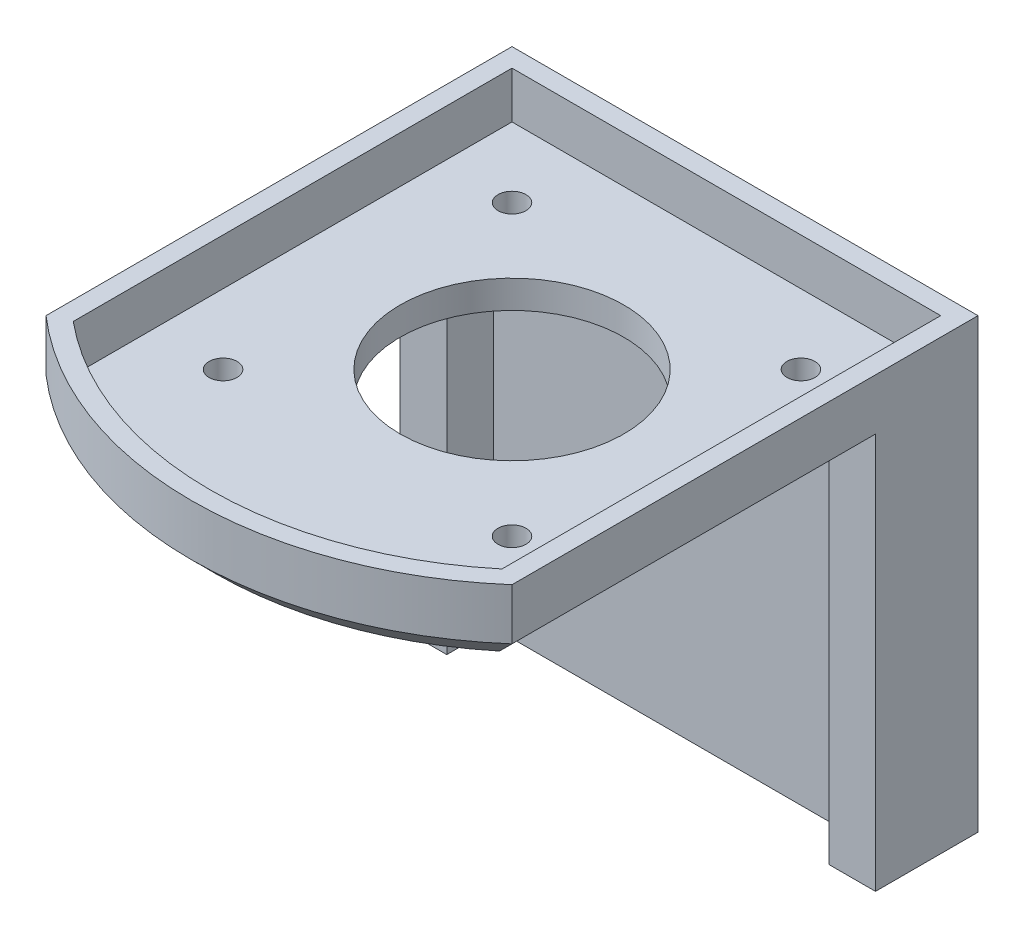
ISO-10303-21;
HEADER;
FILE_DESCRIPTION(('STEP AP214'),'2;1');
FILE_NAME('part.step','',(''),(''),'','','');
FILE_SCHEMA(('AUTOMOTIVE_DESIGN { 1 0 10303 214 1 1 1 1 }'));
ENDSEC;
DATA;
#1=APPLICATION_CONTEXT('core data for automotive mechanical design processes');
#2=APPLICATION_PROTOCOL_DEFINITION('international standard','automotive_design',2000,#1);
#3=PRODUCT_CONTEXT('',#1,'mechanical');
#4=PRODUCT('Part','Part','',(#3));
#5=PRODUCT_RELATED_PRODUCT_CATEGORY('part','',(#4));
#6=PRODUCT_DEFINITION_FORMATION('','',#4);
#7=PRODUCT_DEFINITION_CONTEXT('part definition',#1,'design');
#8=PRODUCT_DEFINITION('design','',#6,#7);
#9=PRODUCT_DEFINITION_SHAPE('','',#8);
#10=(LENGTH_UNIT() NAMED_UNIT(*) SI_UNIT(.MILLI.,.METRE.));
#11=(NAMED_UNIT(*) PLANE_ANGLE_UNIT() SI_UNIT($,.RADIAN.));
#12=(NAMED_UNIT(*) SI_UNIT($,.STERADIAN.) SOLID_ANGLE_UNIT());
#13=UNCERTAINTY_MEASURE_WITH_UNIT(LENGTH_MEASURE(1.E-05),#10,'distance_accuracy_value','');
#14=(GEOMETRIC_REPRESENTATION_CONTEXT(3) GLOBAL_UNCERTAINTY_ASSIGNED_CONTEXT((#13)) GLOBAL_UNIT_ASSIGNED_CONTEXT((#10,
#11,#12)) REPRESENTATION_CONTEXT('',''));
#15=CARTESIAN_POINT('',(0.,0.,0.));
#16=DIRECTION('',(0.,0.,1.));
#17=DIRECTION('',(1.,0.,0.));
#18=AXIS2_PLACEMENT_3D('',#15,#16,#17);
#19=CARTESIAN_POINT('',(0.,0.,0.));
#20=DIRECTION('',(0.,1.,0.));
#21=DIRECTION('',(0.,0.,1.));
#22=AXIS2_PLACEMENT_3D('',#19,#20,#21);
#23=PLANE('',#22);
#24=CARTESIAN_POINT('',(0.,0.,3.61817604250837));
#25=DIRECTION('',(0.,1.,0.));
#26=DIRECTION('',(0.,0.,1.));
#27=AXIS2_PLACEMENT_3D('',#24,#25,#26);
#28=CIRCLE('',#27,12.);
#29=CARTESIAN_POINT('',(0.,0.,15.6181760425084));
#30=VERTEX_POINT('',#29);
#31=EDGE_CURVE('E422',#30,#30,#28,.T.);
#32=ORIENTED_EDGE('',*,*,#31,.T.);
#33=EDGE_LOOP('',(#32));
#34=FACE_BOUND('',#33,.T.);
#35=CARTESIAN_POINT('',(15.5,0.,-11.8818239574916));
#36=DIRECTION('',(0.,1.,0.));
#37=DIRECTION('',(0.,0.,1.));
#38=AXIS2_PLACEMENT_3D('',#35,#36,#37);
#39=CIRCLE('',#38,1.5);
#40=CARTESIAN_POINT('',(15.5,0.,-10.3818239574916));
#41=VERTEX_POINT('',#40);
#42=EDGE_CURVE('E442',#41,#41,#39,.T.);
#43=ORIENTED_EDGE('',*,*,#42,.T.);
#44=EDGE_LOOP('',(#43));
#45=FACE_BOUND('',#44,.T.);
#46=CARTESIAN_POINT('',(-15.5,0.,-11.8818239574916));
#47=DIRECTION('',(0.,1.,0.));
#48=DIRECTION('',(0.,0.,1.));
#49=AXIS2_PLACEMENT_3D('',#46,#47,#48);
#50=CIRCLE('',#49,1.5);
#51=CARTESIAN_POINT('',(-15.5,0.,-10.3818239574916));
#52=VERTEX_POINT('',#51);
#53=EDGE_CURVE('E446',#52,#52,#50,.T.);
#54=ORIENTED_EDGE('',*,*,#53,.T.);
#55=EDGE_LOOP('',(#54));
#56=FACE_BOUND('',#55,.T.);
#57=CARTESIAN_POINT('',(-15.5,0.,19.1181760425084));
#58=DIRECTION('',(0.,1.,0.));
#59=DIRECTION('',(0.,0.,1.));
#60=AXIS2_PLACEMENT_3D('',#57,#58,#59);
#61=CIRCLE('',#60,1.5);
#62=CARTESIAN_POINT('',(-15.5,0.,20.6181760425084));
#63=VERTEX_POINT('',#62);
#64=EDGE_CURVE('E450',#63,#63,#61,.T.);
#65=ORIENTED_EDGE('',*,*,#64,.T.);
#66=EDGE_LOOP('',(#65));
#67=FACE_BOUND('',#66,.T.);
#68=CARTESIAN_POINT('',(15.5,0.,19.1181760425084));
#69=DIRECTION('',(0.,1.,0.));
#70=DIRECTION('',(0.,0.,1.));
#71=AXIS2_PLACEMENT_3D('',#68,#69,#70);
#72=CIRCLE('',#71,1.5);
#73=CARTESIAN_POINT('',(15.5,0.,20.6181760425084));
#74=VERTEX_POINT('',#73);
#75=EDGE_CURVE('E428',#74,#74,#72,.T.);
#76=ORIENTED_EDGE('',*,*,#75,.T.);
#77=EDGE_LOOP('',(#76));
#78=FACE_BOUND('',#77,.T.);
#79=DIRECTION('',(0.,0.,1.));
#80=VECTOR('',#79,1.);
#81=CARTESIAN_POINT('',(22.4999999999999,0.,0.));
#82=LINE('',#81,#80);
#83=CARTESIAN_POINT('',(22.4999999999998,0.,-10.3818239574916));
#84=VERTEX_POINT('',#83);
#85=CARTESIAN_POINT('',(22.5,0.,27.459060435492));
#86=VERTEX_POINT('',#85);
#87=EDGE_CURVE('E463',#84,#86,#82,.T.);
#88=ORIENTED_EDGE('',*,*,#87,.T.);
#89=CARTESIAN_POINT('',(0.,0.,0.));
#90=DIRECTION('',(0.,1.,0.));
#91=DIRECTION('',(0.,0.,1.));
#92=AXIS2_PLACEMENT_3D('',#89,#90,#91);
#93=CIRCLE('',#92,35.5);
#94=CARTESIAN_POINT('',(-22.5,0.,27.4590604354919));
#95=VERTEX_POINT('',#94);
#96=EDGE_CURVE('E59',#86,#95,#93,.F.);
#97=ORIENTED_EDGE('',*,*,#96,.T.);
#98=DIRECTION('',(0.,0.,-1.));
#99=VECTOR('',#98,1.);
#100=CARTESIAN_POINT('',(-22.5,0.,-9.38182395749164));
#101=LINE('',#100,#99);
#102=CARTESIAN_POINT('',(-22.5,0.,-9.38182395749164));
#103=VERTEX_POINT('',#102);
#104=EDGE_CURVE('E469',#95,#103,#101,.T.);
#105=ORIENTED_EDGE('',*,*,#104,.T.);
#106=DIRECTION('',(-1.,0.,0.));
#107=VECTOR('',#106,1.);
#108=CARTESIAN_POINT('',(-25.,0.,-9.38182395749164));
#109=LINE('',#108,#107);
#110=CARTESIAN_POINT('',(-20.,0.,-9.38182395749164));
#111=VERTEX_POINT('',#110);
#112=EDGE_CURVE('E284',#111,#103,#109,.T.);
#113=ORIENTED_EDGE('',*,*,#112,.F.);
#114=DIRECTION('',(0.,0.,1.));
#115=VECTOR('',#114,1.);
#116=CARTESIAN_POINT('',(-20.,0.,-9.38182395749164));
#117=LINE('',#116,#115);
#118=CARTESIAN_POINT('',(-20.,0.,-14.3818239574916));
#119=VERTEX_POINT('',#118);
#120=EDGE_CURVE('E317',#119,#111,#117,.T.);
#121=ORIENTED_EDGE('',*,*,#120,.F.);
#122=DIRECTION('',(-1.,0.,0.));
#123=VECTOR('',#122,1.);
#124=CARTESIAN_POINT('',(-20.,0.,-14.3818239574916));
#125=LINE('',#124,#123);
#126=CARTESIAN_POINT('',(20.,0.,-14.3818239574916));
#127=VERTEX_POINT('',#126);
#128=EDGE_CURVE('E313',#127,#119,#125,.T.);
#129=ORIENTED_EDGE('',*,*,#128,.F.);
#130=DIRECTION('',(0.,0.,-1.));
#131=VECTOR('',#130,1.);
#132=CARTESIAN_POINT('',(20.,0.,-14.3818239574916));
#133=LINE('',#132,#131);
#134=CARTESIAN_POINT('',(20.,0.,-10.3818239574916));
#135=VERTEX_POINT('',#134);
#136=EDGE_CURVE('E309',#135,#127,#133,.T.);
#137=ORIENTED_EDGE('',*,*,#136,.F.);
#138=DIRECTION('',(-1.,0.,0.));
#139=VECTOR('',#138,1.);
#140=CARTESIAN_POINT('',(20.,0.,-10.3818239574916));
#141=LINE('',#140,#139);
#142=EDGE_CURVE('E267',#84,#135,#141,.T.);
#143=ORIENTED_EDGE('',*,*,#142,.F.);
#144=EDGE_LOOP('',(#88,#97,#105,#113,#121,#129,#137,#143));
#145=FACE_BOUND('',#144,.T.);
#146=ADVANCED_FACE('F44',(#34,#45,#56,#67,#78,#145),#23,.F.);
#147=CARTESIAN_POINT('',(0.,3.,0.));
#148=DIRECTION('',(0.,-1.,0.));
#149=DIRECTION('',(0.,0.,-1.));
#150=AXIS2_PLACEMENT_3D('',#147,#148,#149);
#151=CYLINDRICAL_SURFACE('',#150,38.);
#152=DIRECTION('',(0.,-1.,0.));
#153=VECTOR('',#152,1.);
#154=CARTESIAN_POINT('',(-25.,3.,28.6181760425084));
#155=LINE('',#154,#153);
#156=CARTESIAN_POINT('',(-25.,8.,28.6181760425084));
#157=VERTEX_POINT('',#156);
#158=CARTESIAN_POINT('',(-25.,2.5,28.6181760425084));
#159=VERTEX_POINT('',#158);
#160=EDGE_CURVE('E423',#157,#159,#155,.T.);
#161=ORIENTED_EDGE('',*,*,#160,.T.);
#162=CARTESIAN_POINT('',(0.,2.50000000000002,0.));
#163=DIRECTION('',(0.,1.,0.));
#164=DIRECTION('',(0.,0.,1.));
#165=AXIS2_PLACEMENT_3D('',#162,#163,#164);
#166=CIRCLE('',#165,38.);
#167=CARTESIAN_POINT('',(25.,2.50000000000003,28.6181760425084));
#168=VERTEX_POINT('',#167);
#169=EDGE_CURVE('E480',#159,#168,#166,.T.);
#170=ORIENTED_EDGE('',*,*,#169,.T.);
#171=DIRECTION('',(0.,-1.,0.));
#172=VECTOR('',#171,1.);
#173=CARTESIAN_POINT('',(25.,3.,28.6181760425084));
#174=LINE('',#173,#172);
#175=CARTESIAN_POINT('',(25.,8.,28.6181760425084));
#176=VERTEX_POINT('',#175);
#177=EDGE_CURVE('E434',#176,#168,#174,.T.);
#178=ORIENTED_EDGE('',*,*,#177,.F.);
#179=CARTESIAN_POINT('',(0.,8.,0.));
#180=DIRECTION('',(0.,1.,0.));
#181=DIRECTION('',(0.,0.,1.));
#182=AXIS2_PLACEMENT_3D('',#179,#180,#181);
#183=CIRCLE('',#182,38.);
#184=EDGE_CURVE('E364',#157,#176,#183,.T.);
#185=ORIENTED_EDGE('',*,*,#184,.F.);
#186=EDGE_LOOP('',(#161,#170,#178,#185));
#187=FACE_BOUND('',#186,.T.);
#188=ADVANCED_FACE('F500',(#187),#151,.T.);
#189=CARTESIAN_POINT('',(24.9999999999999,3.,0.));
#190=DIRECTION('',(-1.,0.,0.));
#191=DIRECTION('',(0.,0.,1.));
#192=AXIS2_PLACEMENT_3D('',#189,#190,#191);
#193=PLANE('',#192);
#194=ORIENTED_EDGE('',*,*,#177,.T.);
#195=DIRECTION('',(0.,0.,-1.));
#196=VECTOR('',#195,1.);
#197=CARTESIAN_POINT('',(24.9999999999999,2.50000000000003,0.));
#198=LINE('',#197,#196);
#199=CARTESIAN_POINT('',(25.,2.50000000000003,-10.3818239574916));
#200=VERTEX_POINT('',#199);
#201=EDGE_CURVE('E438',#168,#200,#198,.T.);
#202=ORIENTED_EDGE('',*,*,#201,.T.);
#203=DIRECTION('',(0.,1.,0.));
#204=VECTOR('',#203,1.);
#205=CARTESIAN_POINT('',(25.,-40.,-10.3818239574916));
#206=LINE('',#205,#204);
#207=CARTESIAN_POINT('',(25.,-40.,-10.3818239574916));
#208=VERTEX_POINT('',#207);
#209=EDGE_CURVE('E342',#208,#200,#206,.T.);
#210=ORIENTED_EDGE('',*,*,#209,.F.);
#211=DIRECTION('',(0.,0.,1.));
#212=VECTOR('',#211,1.);
#213=CARTESIAN_POINT('',(25.,-40.,-10.3818239574916));
#214=LINE('',#213,#212);
#215=CARTESIAN_POINT('',(24.9999999999998,-40.,-21.3818239574916));
#216=VERTEX_POINT('',#215);
#217=EDGE_CURVE('E283',#216,#208,#214,.T.);
#218=ORIENTED_EDGE('',*,*,#217,.F.);
#219=DIRECTION('',(0.,-1.,0.));
#220=VECTOR('',#219,1.);
#221=CARTESIAN_POINT('',(24.9999999999998,3.,-21.3818239574916));
#222=LINE('',#221,#220);
#223=CARTESIAN_POINT('',(24.9999999999998,8.,-21.3818239574916));
#224=VERTEX_POINT('',#223);
#225=EDGE_CURVE('E431',#224,#216,#222,.T.);
#226=ORIENTED_EDGE('',*,*,#225,.F.);
#227=DIRECTION('',(0.,0.,-1.));
#228=VECTOR('',#227,1.);
#229=CARTESIAN_POINT('',(24.9999999999999,8.,0.));
#230=LINE('',#229,#228);
#231=EDGE_CURVE('E368',#176,#224,#230,.T.);
#232=ORIENTED_EDGE('',*,*,#231,.F.);
#233=EDGE_LOOP('',(#194,#202,#210,#218,#226,#232));
#234=FACE_BOUND('',#233,.T.);
#235=ADVANCED_FACE('F518',(#234),#193,.F.);
#236=CARTESIAN_POINT('',(0.,3.,-21.3818239574916));
#237=DIRECTION('',(0.,0.,-1.));
#238=DIRECTION('',(-1.,0.,0.));
#239=AXIS2_PLACEMENT_3D('',#236,#237,#238);
#240=PLANE('',#239);
#241=DIRECTION('',(-0.5,-0.866025403784439,0.));
#242=VECTOR('',#241,1.);
#243=CARTESIAN_POINT('',(10.6782032302754,-6.16506350946105,-21.3818239574916));
#244=LINE('',#243,#242);
#245=CARTESIAN_POINT('',(4.9999999999999,-16.,-21.3818239574916));
#246=VERTEX_POINT('',#245);
#247=CARTESIAN_POINT('',(2.4999999999999,-20.3301270189222,-21.3818239574916));
#248=VERTEX_POINT('',#247);
#249=EDGE_CURVE('E206',#246,#248,#244,.T.);
#250=ORIENTED_EDGE('',*,*,#249,.F.);
#251=DIRECTION('',(0.5,-0.866025403784439,0.));
#252=VECTOR('',#251,1.);
#253=CARTESIAN_POINT('',(-3.17820323027558,-1.83493649053895,-21.3818239574916));
#254=LINE('',#253,#252);
#255=CARTESIAN_POINT('',(2.4999999999999,-11.6698729810778,-21.3818239574916));
#256=VERTEX_POINT('',#255);
#257=EDGE_CURVE('E227',#256,#246,#254,.T.);
#258=ORIENTED_EDGE('',*,*,#257,.F.);
#259=DIRECTION('',(1.,0.,0.));
#260=VECTOR('',#259,1.);
#261=CARTESIAN_POINT('',(0.,-11.6698729810778,-21.3818239574916));
#262=LINE('',#261,#260);
#263=CARTESIAN_POINT('',(-2.50000000000009,-11.6698729810778,-21.3818239574916));
#264=VERTEX_POINT('',#263);
#265=EDGE_CURVE('E231',#264,#256,#262,.T.);
#266=ORIENTED_EDGE('',*,*,#265,.F.);
#267=DIRECTION('',(0.5,0.866025403784439,0.));
#268=VECTOR('',#267,1.);
#269=CARTESIAN_POINT('',(3.17820323027544,-1.83493649053886,-21.3818239574916));
#270=LINE('',#269,#268);
#271=CARTESIAN_POINT('',(-5.0000000000001,-16.,-21.3818239574916));
#272=VERTEX_POINT('',#271);
#273=EDGE_CURVE('E257',#272,#264,#270,.T.);
#274=ORIENTED_EDGE('',*,*,#273,.F.);
#275=DIRECTION('',(-0.5,0.866025403784439,0.));
#276=VECTOR('',#275,1.);
#277=CARTESIAN_POINT('',(-10.6782032302756,-6.16506350946114,-21.3818239574916));
#278=LINE('',#277,#276);
#279=CARTESIAN_POINT('',(-2.5000000000001,-20.3301270189222,-21.3818239574916));
#280=VERTEX_POINT('',#279);
#281=EDGE_CURVE('E253',#280,#272,#278,.T.);
#282=ORIENTED_EDGE('',*,*,#281,.F.);
#283=DIRECTION('',(-1.,0.,0.));
#284=VECTOR('',#283,1.);
#285=CARTESIAN_POINT('',(0.,-20.3301270189222,-21.3818239574916));
#286=LINE('',#285,#284);
#287=EDGE_CURVE('E249',#248,#280,#286,.T.);
#288=ORIENTED_EDGE('',*,*,#287,.F.);
#289=EDGE_LOOP('',(#250,#258,#266,#274,#282,#288));
#290=FACE_BOUND('',#289,.T.);
#291=ORIENTED_EDGE('',*,*,#225,.T.);
#292=DIRECTION('',(1.,0.,0.));
#293=VECTOR('',#292,1.);
#294=CARTESIAN_POINT('',(24.9999999999998,-40.,-21.3818239574916));
#295=LINE('',#294,#293);
#296=CARTESIAN_POINT('',(-25.,-40.,-21.3818239574916));
#297=VERTEX_POINT('',#296);
#298=EDGE_CURVE('E279',#297,#216,#295,.T.);
#299=ORIENTED_EDGE('',*,*,#298,.F.);
#300=DIRECTION('',(0.,-1.,0.));
#301=VECTOR('',#300,1.);
#302=CARTESIAN_POINT('',(-25.,3.,-21.3818239574916));
#303=LINE('',#302,#301);
#304=CARTESIAN_POINT('',(-25.,8.,-21.3818239574916));
#305=VERTEX_POINT('',#304);
#306=EDGE_CURVE('E427',#305,#297,#303,.T.);
#307=ORIENTED_EDGE('',*,*,#306,.F.);
#308=DIRECTION('',(-1.,0.,0.));
#309=VECTOR('',#308,1.);
#310=CARTESIAN_POINT('',(0.,8.,-21.3818239574916));
#311=LINE('',#310,#309);
#312=EDGE_CURVE('E372',#224,#305,#311,.T.);
#313=ORIENTED_EDGE('',*,*,#312,.F.);
#314=EDGE_LOOP('',(#291,#299,#307,#313));
#315=FACE_BOUND('',#314,.T.);
#316=ADVANCED_FACE('F528',(#290,#315),#240,.T.);
#317=CARTESIAN_POINT('',(-25.,3.,0.));
#318=DIRECTION('',(-1.,0.,0.));
#319=DIRECTION('',(0.,0.,1.));
#320=AXIS2_PLACEMENT_3D('',#317,#318,#319);
#321=PLANE('',#320);
#322=DIRECTION('',(0.,1.,0.));
#323=VECTOR('',#322,1.);
#324=CARTESIAN_POINT('',(-25.,-40.,-9.38182395749164));
#325=LINE('',#324,#323);
#326=CARTESIAN_POINT('',(-25.,-40.,-9.38182395749164));
#327=VERTEX_POINT('',#326);
#328=CARTESIAN_POINT('',(-25.,2.5,-9.38182395749164));
#329=VERTEX_POINT('',#328);
#330=EDGE_CURVE('E306',#327,#329,#325,.T.);
#331=ORIENTED_EDGE('',*,*,#330,.T.);
#332=DIRECTION('',(0.,0.,1.));
#333=VECTOR('',#332,1.);
#334=CARTESIAN_POINT('',(-25.,2.5,28.6181760425084));
#335=LINE('',#334,#333);
#336=EDGE_CURVE('E472',#329,#159,#335,.T.);
#337=ORIENTED_EDGE('',*,*,#336,.T.);
#338=ORIENTED_EDGE('',*,*,#160,.F.);
#339=DIRECTION('',(0.,0.,1.));
#340=VECTOR('',#339,1.);
#341=CARTESIAN_POINT('',(-25.,8.,0.));
#342=LINE('',#341,#340);
#343=EDGE_CURVE('E360',#305,#157,#342,.T.);
#344=ORIENTED_EDGE('',*,*,#343,.F.);
#345=ORIENTED_EDGE('',*,*,#306,.T.);
#346=DIRECTION('',(0.,0.,-1.));
#347=VECTOR('',#346,1.);
#348=CARTESIAN_POINT('',(-25.,-40.,-21.3818239574916));
#349=LINE('',#348,#347);
#350=EDGE_CURVE('E302',#327,#297,#349,.T.);
#351=ORIENTED_EDGE('',*,*,#350,.F.);
#352=EDGE_LOOP('',(#331,#337,#338,#344,#345,#351));
#353=FACE_BOUND('',#352,.T.);
#354=ADVANCED_FACE('F525',(#353),#321,.T.);
#355=CARTESIAN_POINT('',(0.,3.,0.));
#356=DIRECTION('',(0.,1.,0.));
#357=DIRECTION('',(0.,0.,1.));
#358=AXIS2_PLACEMENT_3D('',#355,#356,#357);
#359=PLANE('',#358);
#360=CARTESIAN_POINT('',(0.,3.,0.));
#361=DIRECTION('',(0.,1.,0.));
#362=DIRECTION('',(0.,0.,1.));
#363=AXIS2_PLACEMENT_3D('',#360,#361,#362);
#364=CIRCLE('',#363,36.);
#365=CARTESIAN_POINT('',(-23.,3.,27.6947648482525));
#366=VERTEX_POINT('',#365);
#367=CARTESIAN_POINT('',(23.,3.,27.6947648482525));
#368=VERTEX_POINT('',#367);
#369=EDGE_CURVE('E345',#366,#368,#364,.T.);
#370=ORIENTED_EDGE('',*,*,#369,.T.);
#371=DIRECTION('',(0.,0.,1.));
#372=VECTOR('',#371,1.);
#373=CARTESIAN_POINT('',(23.,3.,0.));
#374=LINE('',#373,#372);
#375=CARTESIAN_POINT('',(23.,3.,-19.3818239574916));
#376=VERTEX_POINT('',#375);
#377=EDGE_CURVE('E351',#376,#368,#374,.T.);
#378=ORIENTED_EDGE('',*,*,#377,.F.);
#379=DIRECTION('',(1.,0.,0.));
#380=VECTOR('',#379,1.);
#381=CARTESIAN_POINT('',(0.,3.,-19.3818239574916));
#382=LINE('',#381,#380);
#383=CARTESIAN_POINT('',(-23.,3.,-19.3818239574916));
#384=VERTEX_POINT('',#383);
#385=EDGE_CURVE('E383',#384,#376,#382,.T.);
#386=ORIENTED_EDGE('',*,*,#385,.F.);
#387=DIRECTION('',(0.,0.,-1.));
#388=VECTOR('',#387,1.);
#389=CARTESIAN_POINT('',(-23.,3.,0.));
#390=LINE('',#389,#388);
#391=EDGE_CURVE('E380',#366,#384,#390,.T.);
#392=ORIENTED_EDGE('',*,*,#391,.F.);
#393=EDGE_LOOP('',(#370,#378,#386,#392));
#394=FACE_BOUND('',#393,.T.);
#395=CARTESIAN_POINT('',(15.5,3.,19.1181760425084));
#396=DIRECTION('',(0.,1.,0.));
#397=DIRECTION('',(0.,0.,1.));
#398=AXIS2_PLACEMENT_3D('',#395,#396,#397);
#399=CIRCLE('',#398,1.5);
#400=CARTESIAN_POINT('',(15.5,3.,20.6181760425084));
#401=VERTEX_POINT('',#400);
#402=EDGE_CURVE('E402',#401,#401,#399,.T.);
#403=ORIENTED_EDGE('',*,*,#402,.F.);
#404=EDGE_LOOP('',(#403));
#405=FACE_BOUND('',#404,.T.);
#406=CARTESIAN_POINT('',(-15.5,3.,19.1181760425084));
#407=DIRECTION('',(0.,1.,0.));
#408=DIRECTION('',(0.,0.,1.));
#409=AXIS2_PLACEMENT_3D('',#406,#407,#408);
#410=CIRCLE('',#409,1.5);
#411=CARTESIAN_POINT('',(-15.5,3.,20.6181760425084));
#412=VERTEX_POINT('',#411);
#413=EDGE_CURVE('E412',#412,#412,#410,.T.);
#414=ORIENTED_EDGE('',*,*,#413,.F.);
#415=EDGE_LOOP('',(#414));
#416=FACE_BOUND('',#415,.T.);
#417=CARTESIAN_POINT('',(-15.5,3.,-11.8818239574916));
#418=DIRECTION('',(0.,1.,0.));
#419=DIRECTION('',(0.,0.,1.));
#420=AXIS2_PLACEMENT_3D('',#417,#418,#419);
#421=CIRCLE('',#420,1.5);
#422=CARTESIAN_POINT('',(-15.5,3.,-10.3818239574916));
#423=VERTEX_POINT('',#422);
#424=EDGE_CURVE('E408',#423,#423,#421,.T.);
#425=ORIENTED_EDGE('',*,*,#424,.F.);
#426=EDGE_LOOP('',(#425));
#427=FACE_BOUND('',#426,.T.);
#428=CARTESIAN_POINT('',(15.5,3.,-11.8818239574916));
#429=DIRECTION('',(0.,1.,0.));
#430=DIRECTION('',(0.,0.,1.));
#431=AXIS2_PLACEMENT_3D('',#428,#429,#430);
#432=CIRCLE('',#431,1.5);
#433=CARTESIAN_POINT('',(15.5,3.,-10.3818239574916));
#434=VERTEX_POINT('',#433);
#435=EDGE_CURVE('E403',#434,#434,#432,.T.);
#436=ORIENTED_EDGE('',*,*,#435,.F.);
#437=EDGE_LOOP('',(#436));
#438=FACE_BOUND('',#437,.T.);
#439=CARTESIAN_POINT('',(0.,3.,3.61817604250837));
#440=DIRECTION('',(0.,1.,0.));
#441=DIRECTION('',(0.,0.,1.));
#442=AXIS2_PLACEMENT_3D('',#439,#440,#441);
#443=CIRCLE('',#442,12.);
#444=CARTESIAN_POINT('',(0.,3.,15.6181760425084));
#445=VERTEX_POINT('',#444);
#446=EDGE_CURVE('E407',#445,#445,#443,.T.);
#447=ORIENTED_EDGE('',*,*,#446,.F.);
#448=EDGE_LOOP('',(#447));
#449=FACE_BOUND('',#448,.T.);
#450=ADVANCED_FACE('F523',(#394,#405,#416,#427,#438,#449),#359,.T.);
#451=CARTESIAN_POINT('',(0.,-1.,3.61817604250837));
#452=DIRECTION('',(0.,1.,0.));
#453=DIRECTION('',(0.,0.,1.));
#454=AXIS2_PLACEMENT_3D('',#451,#452,#453);
#455=CYLINDRICAL_SURFACE('',#454,12.);
#456=ORIENTED_EDGE('',*,*,#446,.T.);
#457=EDGE_LOOP('',(#456));
#458=FACE_BOUND('',#457,.T.);
#459=ORIENTED_EDGE('',*,*,#31,.F.);
#460=EDGE_LOOP('',(#459));
#461=FACE_BOUND('',#460,.T.);
#462=ADVANCED_FACE('F616',(#458,#461),#455,.F.);
#463=CARTESIAN_POINT('',(15.5,-1.,-11.8818239574916));
#464=DIRECTION('',(0.,1.,0.));
#465=DIRECTION('',(0.,0.,1.));
#466=AXIS2_PLACEMENT_3D('',#463,#464,#465);
#467=CYLINDRICAL_SURFACE('',#466,1.5);
#468=ORIENTED_EDGE('',*,*,#435,.T.);
#469=EDGE_LOOP('',(#468));
#470=FACE_BOUND('',#469,.T.);
#471=ORIENTED_EDGE('',*,*,#42,.F.);
#472=EDGE_LOOP('',(#471));
#473=FACE_BOUND('',#472,.T.);
#474=ADVANCED_FACE('F612',(#470,#473),#467,.F.);
#475=CARTESIAN_POINT('',(-15.5,-1.,-11.8818239574916));
#476=DIRECTION('',(0.,1.,0.));
#477=DIRECTION('',(0.,0.,1.));
#478=AXIS2_PLACEMENT_3D('',#475,#476,#477);
#479=CYLINDRICAL_SURFACE('',#478,1.5);
#480=ORIENTED_EDGE('',*,*,#424,.T.);
#481=EDGE_LOOP('',(#480));
#482=FACE_BOUND('',#481,.T.);
#483=ORIENTED_EDGE('',*,*,#53,.F.);
#484=EDGE_LOOP('',(#483));
#485=FACE_BOUND('',#484,.T.);
#486=ADVANCED_FACE('F615',(#482,#485),#479,.F.);
#487=CARTESIAN_POINT('',(-15.5,-1.,19.1181760425084));
#488=DIRECTION('',(0.,1.,0.));
#489=DIRECTION('',(0.,0.,1.));
#490=AXIS2_PLACEMENT_3D('',#487,#488,#489);
#491=CYLINDRICAL_SURFACE('',#490,1.5);
#492=ORIENTED_EDGE('',*,*,#413,.T.);
#493=EDGE_LOOP('',(#492));
#494=FACE_BOUND('',#493,.T.);
#495=ORIENTED_EDGE('',*,*,#64,.F.);
#496=EDGE_LOOP('',(#495));
#497=FACE_BOUND('',#496,.T.);
#498=ADVANCED_FACE('F620',(#494,#497),#491,.F.);
#499=CARTESIAN_POINT('',(15.5,-1.,19.1181760425084));
#500=DIRECTION('',(0.,1.,0.));
#501=DIRECTION('',(0.,0.,1.));
#502=AXIS2_PLACEMENT_3D('',#499,#500,#501);
#503=CYLINDRICAL_SURFACE('',#502,1.5);
#504=ORIENTED_EDGE('',*,*,#402,.T.);
#505=EDGE_LOOP('',(#504));
#506=FACE_BOUND('',#505,.T.);
#507=ORIENTED_EDGE('',*,*,#75,.F.);
#508=EDGE_LOOP('',(#507));
#509=FACE_BOUND('',#508,.T.);
#510=ADVANCED_FACE('F610',(#506,#509),#503,.F.);
#511=CARTESIAN_POINT('',(0.,8.,0.));
#512=DIRECTION('',(0.,-1.,0.));
#513=DIRECTION('',(0.,0.,-1.));
#514=AXIS2_PLACEMENT_3D('',#511,#512,#513);
#515=CYLINDRICAL_SURFACE('',#514,36.);
#516=ORIENTED_EDGE('',*,*,#369,.F.);
#517=DIRECTION('',(0.,-1.,0.));
#518=VECTOR('',#517,1.);
#519=CARTESIAN_POINT('',(-23.,8.,27.6947648482525));
#520=LINE('',#519,#518);
#521=CARTESIAN_POINT('',(-23.,8.,27.6947648482525));
#522=VERTEX_POINT('',#521);
#523=EDGE_CURVE('E399',#522,#366,#520,.T.);
#524=ORIENTED_EDGE('',*,*,#523,.F.);
#525=CARTESIAN_POINT('',(0.,8.,0.));
#526=DIRECTION('',(0.,1.,0.));
#527=DIRECTION('',(0.,0.,1.));
#528=AXIS2_PLACEMENT_3D('',#525,#526,#527);
#529=CIRCLE('',#528,36.);
#530=CARTESIAN_POINT('',(23.,8.,27.6947648482525));
#531=VERTEX_POINT('',#530);
#532=EDGE_CURVE('E346',#522,#531,#529,.T.);
#533=ORIENTED_EDGE('',*,*,#532,.T.);
#534=DIRECTION('',(0.,-1.,0.));
#535=VECTOR('',#534,1.);
#536=CARTESIAN_POINT('',(23.,8.,27.6947648482525));
#537=LINE('',#536,#535);
#538=EDGE_CURVE('E376',#531,#368,#537,.T.);
#539=ORIENTED_EDGE('',*,*,#538,.T.);
#540=EDGE_LOOP('',(#516,#524,#533,#539));
#541=FACE_BOUND('',#540,.T.);
#542=ADVANCED_FACE('F606',(#541),#515,.F.);
#543=CARTESIAN_POINT('',(-23.,8.,0.));
#544=DIRECTION('',(-1.,0.,0.));
#545=DIRECTION('',(0.,0.,1.));
#546=AXIS2_PLACEMENT_3D('',#543,#544,#545);
#547=PLANE('',#546);
#548=ORIENTED_EDGE('',*,*,#391,.T.);
#549=DIRECTION('',(0.,-1.,0.));
#550=VECTOR('',#549,1.);
#551=CARTESIAN_POINT('',(-23.,8.,-19.3818239574916));
#552=LINE('',#551,#550);
#553=CARTESIAN_POINT('',(-23.,8.,-19.3818239574916));
#554=VERTEX_POINT('',#553);
#555=EDGE_CURVE('E395',#554,#384,#552,.T.);
#556=ORIENTED_EDGE('',*,*,#555,.F.);
#557=DIRECTION('',(0.,0.,-1.));
#558=VECTOR('',#557,1.);
#559=CARTESIAN_POINT('',(-23.,8.,0.));
#560=LINE('',#559,#558);
#561=EDGE_CURVE('E350',#522,#554,#560,.T.);
#562=ORIENTED_EDGE('',*,*,#561,.F.);
#563=ORIENTED_EDGE('',*,*,#523,.T.);
#564=EDGE_LOOP('',(#548,#556,#562,#563));
#565=FACE_BOUND('',#564,.T.);
#566=ADVANCED_FACE('F602',(#565),#547,.F.);
#567=CARTESIAN_POINT('',(0.,8.,-19.3818239574916));
#568=DIRECTION('',(0.,0.,-1.));
#569=DIRECTION('',(-1.,0.,0.));
#570=AXIS2_PLACEMENT_3D('',#567,#568,#569);
#571=PLANE('',#570);
#572=ORIENTED_EDGE('',*,*,#385,.T.);
#573=DIRECTION('',(0.,-1.,0.));
#574=VECTOR('',#573,1.);
#575=CARTESIAN_POINT('',(23.,8.,-19.3818239574916));
#576=LINE('',#575,#574);
#577=CARTESIAN_POINT('',(23.,8.,-19.3818239574916));
#578=VERTEX_POINT('',#577);
#579=EDGE_CURVE('E392',#578,#376,#576,.T.);
#580=ORIENTED_EDGE('',*,*,#579,.F.);
#581=DIRECTION('',(1.,0.,0.));
#582=VECTOR('',#581,1.);
#583=CARTESIAN_POINT('',(0.,8.,-19.3818239574916));
#584=LINE('',#583,#582);
#585=EDGE_CURVE('E354',#554,#578,#584,.T.);
#586=ORIENTED_EDGE('',*,*,#585,.F.);
#587=ORIENTED_EDGE('',*,*,#555,.T.);
#588=EDGE_LOOP('',(#572,#580,#586,#587));
#589=FACE_BOUND('',#588,.T.);
#590=ADVANCED_FACE('F598',(#589),#571,.F.);
#591=CARTESIAN_POINT('',(23.,8.,0.));
#592=DIRECTION('',(1.,0.,0.));
#593=DIRECTION('',(0.,0.,-1.));
#594=AXIS2_PLACEMENT_3D('',#591,#592,#593);
#595=PLANE('',#594);
#596=ORIENTED_EDGE('',*,*,#377,.T.);
#597=ORIENTED_EDGE('',*,*,#538,.F.);
#598=DIRECTION('',(0.,0.,1.));
#599=VECTOR('',#598,1.);
#600=CARTESIAN_POINT('',(23.,8.,0.));
#601=LINE('',#600,#599);
#602=EDGE_CURVE('E357',#578,#531,#601,.T.);
#603=ORIENTED_EDGE('',*,*,#602,.F.);
#604=ORIENTED_EDGE('',*,*,#579,.T.);
#605=EDGE_LOOP('',(#596,#597,#603,#604));
#606=FACE_BOUND('',#605,.T.);
#607=ADVANCED_FACE('F594',(#606),#595,.F.);
#608=CARTESIAN_POINT('',(0.,8.,0.));
#609=DIRECTION('',(0.,1.,0.));
#610=DIRECTION('',(0.,0.,1.));
#611=AXIS2_PLACEMENT_3D('',#608,#609,#610);
#612=PLANE('',#611);
#613=ORIENTED_EDGE('',*,*,#532,.F.);
#614=ORIENTED_EDGE('',*,*,#561,.T.);
#615=ORIENTED_EDGE('',*,*,#585,.T.);
#616=ORIENTED_EDGE('',*,*,#602,.T.);
#617=EDGE_LOOP('',(#613,#614,#615,#616));
#618=FACE_BOUND('',#617,.T.);
#619=ORIENTED_EDGE('',*,*,#343,.T.);
#620=ORIENTED_EDGE('',*,*,#184,.T.);
#621=ORIENTED_EDGE('',*,*,#231,.T.);
#622=ORIENTED_EDGE('',*,*,#312,.T.);
#623=EDGE_LOOP('',(#619,#620,#621,#622));
#624=FACE_BOUND('',#623,.T.);
#625=ADVANCED_FACE('F557',(#618,#624),#612,.T.);
#626=CARTESIAN_POINT('',(20.,-40.,-10.3818239574916));
#627=DIRECTION('',(0.,0.,-1.));
#628=DIRECTION('',(-1.,0.,0.));
#629=AXIS2_PLACEMENT_3D('',#626,#627,#628);
#630=PLANE('',#629);
#631=ORIENTED_EDGE('',*,*,#209,.T.);
#632=DIRECTION('',(0.707106781186548,0.707106781186548,0.));
#633=VECTOR('',#632,1.);
#634=CARTESIAN_POINT('',(1.24999999999991,-21.2499999999999,-10.3818239574916));
#635=LINE('',#634,#633);
#636=EDGE_CURVE('E466',#200,#84,#635,.F.);
#637=ORIENTED_EDGE('',*,*,#636,.T.);
#638=ORIENTED_EDGE('',*,*,#142,.T.);
#639=DIRECTION('',(0.,1.,0.));
#640=VECTOR('',#639,1.);
#641=CARTESIAN_POINT('',(20.,-40.,-10.3818239574916));
#642=LINE('',#641,#640);
#643=CARTESIAN_POINT('',(20.,-40.,-10.3818239574916));
#644=VERTEX_POINT('',#643);
#645=EDGE_CURVE('E338',#644,#135,#642,.T.);
#646=ORIENTED_EDGE('',*,*,#645,.F.);
#647=DIRECTION('',(-1.,0.,0.));
#648=VECTOR('',#647,1.);
#649=CARTESIAN_POINT('',(20.,-40.,-10.3818239574916));
#650=LINE('',#649,#648);
#651=EDGE_CURVE('E287',#208,#644,#650,.T.);
#652=ORIENTED_EDGE('',*,*,#651,.F.);
#653=EDGE_LOOP('',(#631,#637,#638,#646,#652));
#654=FACE_BOUND('',#653,.T.);
#655=ADVANCED_FACE('F542',(#654),#630,.F.);
#656=CARTESIAN_POINT('',(20.,-40.,-14.3818239574916));
#657=DIRECTION('',(1.,0.,0.));
#658=DIRECTION('',(0.,0.,-1.));
#659=AXIS2_PLACEMENT_3D('',#656,#657,#658);
#660=PLANE('',#659);
#661=ORIENTED_EDGE('',*,*,#136,.T.);
#662=DIRECTION('',(0.,1.,0.));
#663=VECTOR('',#662,1.);
#664=CARTESIAN_POINT('',(20.,-40.,-14.3818239574916));
#665=LINE('',#664,#663);
#666=CARTESIAN_POINT('',(20.,-40.,-14.3818239574916));
#667=VERTEX_POINT('',#666);
#668=EDGE_CURVE('E334',#667,#127,#665,.T.);
#669=ORIENTED_EDGE('',*,*,#668,.F.);
#670=DIRECTION('',(0.,0.,-1.));
#671=VECTOR('',#670,1.);
#672=CARTESIAN_POINT('',(20.,-40.,-14.3818239574916));
#673=LINE('',#672,#671);
#674=EDGE_CURVE('E290',#644,#667,#673,.T.);
#675=ORIENTED_EDGE('',*,*,#674,.F.);
#676=ORIENTED_EDGE('',*,*,#645,.T.);
#677=EDGE_LOOP('',(#661,#669,#675,#676));
#678=FACE_BOUND('',#677,.T.);
#679=ADVANCED_FACE('F549',(#678),#660,.F.);
#680=CARTESIAN_POINT('',(-20.,-40.,-14.3818239574916));
#681=DIRECTION('',(0.,0.,-1.));
#682=DIRECTION('',(-1.,0.,0.));
#683=AXIS2_PLACEMENT_3D('',#680,#681,#682);
#684=PLANE('',#683);
#685=CARTESIAN_POINT('',(0.,-16.,-14.3818239574916));
#686=DIRECTION('',(0.,0.,-1.));
#687=DIRECTION('',(-1.,0.,0.));
#688=AXIS2_PLACEMENT_3D('',#685,#686,#687);
#689=CIRCLE('',#688,1.5);
#690=CARTESIAN_POINT('',(-1.50000000000009,-16.,-14.3818239574916));
#691=VERTEX_POINT('',#690);
#692=EDGE_CURVE('E250',#691,#691,#689,.T.);
#693=ORIENTED_EDGE('',*,*,#692,.T.);
#694=EDGE_LOOP('',(#693));
#695=FACE_BOUND('',#694,.T.);
#696=ORIENTED_EDGE('',*,*,#128,.T.);
#697=DIRECTION('',(0.,1.,0.));
#698=VECTOR('',#697,1.);
#699=CARTESIAN_POINT('',(-20.,-40.,-14.3818239574916));
#700=LINE('',#699,#698);
#701=CARTESIAN_POINT('',(-20.,-40.,-14.3818239574916));
#702=VERTEX_POINT('',#701);
#703=EDGE_CURVE('E330',#702,#119,#700,.T.);
#704=ORIENTED_EDGE('',*,*,#703,.F.);
#705=DIRECTION('',(-1.,0.,0.));
#706=VECTOR('',#705,1.);
#707=CARTESIAN_POINT('',(-20.,-40.,-14.3818239574916));
#708=LINE('',#707,#706);
#709=EDGE_CURVE('E293',#667,#702,#708,.T.);
#710=ORIENTED_EDGE('',*,*,#709,.F.);
#711=ORIENTED_EDGE('',*,*,#668,.T.);
#712=EDGE_LOOP('',(#696,#704,#710,#711));
#713=FACE_BOUND('',#712,.T.);
#714=ADVANCED_FACE('F576',(#695,#713),#684,.F.);
#715=CARTESIAN_POINT('',(-20.,-40.,-9.38182395749164));
#716=DIRECTION('',(-1.,0.,0.));
#717=DIRECTION('',(0.,0.,1.));
#718=AXIS2_PLACEMENT_3D('',#715,#716,#717);
#719=PLANE('',#718);
#720=ORIENTED_EDGE('',*,*,#120,.T.);
#721=DIRECTION('',(0.,1.,0.));
#722=VECTOR('',#721,1.);
#723=CARTESIAN_POINT('',(-20.,-40.,-9.38182395749164));
#724=LINE('',#723,#722);
#725=CARTESIAN_POINT('',(-20.,-40.,-9.38182395749164));
#726=VERTEX_POINT('',#725);
#727=EDGE_CURVE('E326',#726,#111,#724,.T.);
#728=ORIENTED_EDGE('',*,*,#727,.F.);
#729=DIRECTION('',(0.,0.,1.));
#730=VECTOR('',#729,1.);
#731=CARTESIAN_POINT('',(-20.,-40.,-9.38182395749164));
#732=LINE('',#731,#730);
#733=EDGE_CURVE('E296',#702,#726,#732,.T.);
#734=ORIENTED_EDGE('',*,*,#733,.F.);
#735=ORIENTED_EDGE('',*,*,#703,.T.);
#736=EDGE_LOOP('',(#720,#728,#734,#735));
#737=FACE_BOUND('',#736,.T.);
#738=ADVANCED_FACE('F572',(#737),#719,.F.);
#739=CARTESIAN_POINT('',(-25.,-40.,-9.38182395749164));
#740=DIRECTION('',(0.,0.,-1.));
#741=DIRECTION('',(-1.,0.,0.));
#742=AXIS2_PLACEMENT_3D('',#739,#740,#741);
#743=PLANE('',#742);
#744=ORIENTED_EDGE('',*,*,#112,.T.);
#745=DIRECTION('',(-0.707106781186546,0.707106781186549,0.));
#746=VECTOR('',#745,1.);
#747=CARTESIAN_POINT('',(-3.75,-18.7500000000001,-9.38182395749164));
#748=LINE('',#747,#746);
#749=EDGE_CURVE('E476',#103,#329,#748,.T.);
#750=ORIENTED_EDGE('',*,*,#749,.T.);
#751=ORIENTED_EDGE('',*,*,#330,.F.);
#752=DIRECTION('',(-1.,0.,0.));
#753=VECTOR('',#752,1.);
#754=CARTESIAN_POINT('',(-25.,-40.,-9.38182395749164));
#755=LINE('',#754,#753);
#756=EDGE_CURVE('E299',#726,#327,#755,.T.);
#757=ORIENTED_EDGE('',*,*,#756,.F.);
#758=ORIENTED_EDGE('',*,*,#727,.T.);
#759=EDGE_LOOP('',(#744,#750,#751,#757,#758));
#760=FACE_BOUND('',#759,.T.);
#761=ADVANCED_FACE('F565',(#760),#743,.F.);
#762=CARTESIAN_POINT('',(0.,-40.,0.));
#763=DIRECTION('',(0.,1.,0.));
#764=DIRECTION('',(0.,0.,1.));
#765=AXIS2_PLACEMENT_3D('',#762,#763,#764);
#766=PLANE('',#765);
#767=ORIENTED_EDGE('',*,*,#298,.T.);
#768=ORIENTED_EDGE('',*,*,#217,.T.);
#769=ORIENTED_EDGE('',*,*,#651,.T.);
#770=ORIENTED_EDGE('',*,*,#674,.T.);
#771=ORIENTED_EDGE('',*,*,#709,.T.);
#772=ORIENTED_EDGE('',*,*,#733,.T.);
#773=ORIENTED_EDGE('',*,*,#756,.T.);
#774=ORIENTED_EDGE('',*,*,#350,.T.);
#775=EDGE_LOOP('',(#767,#768,#769,#770,#771,#772,#773,#774));
#776=FACE_BOUND('',#775,.T.);
#777=ADVANCED_FACE('F551',(#776),#766,.F.);
#778=CARTESIAN_POINT('',(10.6782032302754,-6.16506350946105,-17.3818239574916));
#779=DIRECTION('',(0.866025403784439,-0.5,0.));
#780=DIRECTION('',(0.5,0.866025403784439,0.));
#781=AXIS2_PLACEMENT_3D('',#778,#779,#780);
#782=PLANE('',#781);
#783=ORIENTED_EDGE('',*,*,#249,.T.);
#784=DIRECTION('',(0.,0.,-1.));
#785=VECTOR('',#784,1.);
#786=CARTESIAN_POINT('',(2.4999999999999,-20.3301270189222,-17.3818239574916));
#787=LINE('',#786,#785);
#788=CARTESIAN_POINT('',(2.4999999999999,-20.3301270189222,-17.3818239574916));
#789=VERTEX_POINT('',#788);
#790=EDGE_CURVE('E199',#789,#248,#787,.T.);
#791=ORIENTED_EDGE('',*,*,#790,.F.);
#792=DIRECTION('',(-0.5,-0.866025403784439,0.));
#793=VECTOR('',#792,1.);
#794=CARTESIAN_POINT('',(10.6782032302754,-6.16506350946105,-17.3818239574916));
#795=LINE('',#794,#793);
#796=CARTESIAN_POINT('',(4.9999999999999,-16.,-17.3818239574916));
#797=VERTEX_POINT('',#796);
#798=EDGE_CURVE('E203',#797,#789,#795,.T.);
#799=ORIENTED_EDGE('',*,*,#798,.F.);
#800=DIRECTION('',(0.,0.,-1.));
#801=VECTOR('',#800,1.);
#802=CARTESIAN_POINT('',(4.9999999999999,-16.,-17.3818239574916));
#803=LINE('',#802,#801);
#804=EDGE_CURVE('E264',#797,#246,#803,.T.);
#805=ORIENTED_EDGE('',*,*,#804,.T.);
#806=EDGE_LOOP('',(#783,#791,#799,#805));
#807=FACE_BOUND('',#806,.T.);
#808=ADVANCED_FACE('F201',(#807),#782,.F.);
#809=CARTESIAN_POINT('',(-3.17820323027558,-1.83493649053895,-17.3818239574916));
#810=DIRECTION('',(0.866025403784439,0.5,0.));
#811=DIRECTION('',(-0.5,0.866025403784439,0.));
#812=AXIS2_PLACEMENT_3D('',#809,#810,#811);
#813=PLANE('',#812);
#814=ORIENTED_EDGE('',*,*,#257,.T.);
#815=ORIENTED_EDGE('',*,*,#804,.F.);
#816=DIRECTION('',(0.5,-0.866025403784439,0.));
#817=VECTOR('',#816,1.);
#818=CARTESIAN_POINT('',(-3.17820323027558,-1.83493649053895,-17.3818239574916));
#819=LINE('',#818,#817);
#820=CARTESIAN_POINT('',(2.4999999999999,-11.6698729810778,-17.3818239574916));
#821=VERTEX_POINT('',#820);
#822=EDGE_CURVE('E212',#821,#797,#819,.T.);
#823=ORIENTED_EDGE('',*,*,#822,.F.);
#824=DIRECTION('',(0.,0.,-1.));
#825=VECTOR('',#824,1.);
#826=CARTESIAN_POINT('',(2.4999999999999,-11.6698729810778,-17.3818239574916));
#827=LINE('',#826,#825);
#828=EDGE_CURVE('E268',#821,#256,#827,.T.);
#829=ORIENTED_EDGE('',*,*,#828,.T.);
#830=EDGE_LOOP('',(#814,#815,#823,#829));
#831=FACE_BOUND('',#830,.T.);
#832=ADVANCED_FACE('F753',(#831),#813,.F.);
#833=CARTESIAN_POINT('',(0.,-11.6698729810778,-17.3818239574916));
#834=DIRECTION('',(0.,1.,0.));
#835=DIRECTION('',(-1.,0.,0.));
#836=AXIS2_PLACEMENT_3D('',#833,#834,#835);
#837=PLANE('',#836);
#838=ORIENTED_EDGE('',*,*,#265,.T.);
#839=ORIENTED_EDGE('',*,*,#828,.F.);
#840=DIRECTION('',(1.,0.,0.));
#841=VECTOR('',#840,1.);
#842=CARTESIAN_POINT('',(0.,-11.6698729810778,-17.3818239574916));
#843=LINE('',#842,#841);
#844=CARTESIAN_POINT('',(-2.50000000000009,-11.6698729810778,-17.3818239574916));
#845=VERTEX_POINT('',#844);
#846=EDGE_CURVE('E242',#845,#821,#843,.T.);
#847=ORIENTED_EDGE('',*,*,#846,.F.);
#848=DIRECTION('',(0.,0.,-1.));
#849=VECTOR('',#848,1.);
#850=CARTESIAN_POINT('',(-2.50000000000009,-11.6698729810778,-17.3818239574916));
#851=LINE('',#850,#849);
#852=EDGE_CURVE('E271',#845,#264,#851,.T.);
#853=ORIENTED_EDGE('',*,*,#852,.T.);
#854=EDGE_LOOP('',(#838,#839,#847,#853));
#855=FACE_BOUND('',#854,.T.);
#856=ADVANCED_FACE('F759',(#855),#837,.F.);
#857=CARTESIAN_POINT('',(3.17820323027544,-1.83493649053886,-17.3818239574916));
#858=DIRECTION('',(-0.866025403784439,0.5,0.));
#859=DIRECTION('',(-0.5,-0.866025403784439,0.));
#860=AXIS2_PLACEMENT_3D('',#857,#858,#859);
#861=PLANE('',#860);
#862=ORIENTED_EDGE('',*,*,#273,.T.);
#863=ORIENTED_EDGE('',*,*,#852,.F.);
#864=DIRECTION('',(0.5,0.866025403784439,0.));
#865=VECTOR('',#864,1.);
#866=CARTESIAN_POINT('',(3.17820323027544,-1.83493649053886,-17.3818239574916));
#867=LINE('',#866,#865);
#868=CARTESIAN_POINT('',(-5.0000000000001,-16.,-17.3818239574916));
#869=VERTEX_POINT('',#868);
#870=EDGE_CURVE('E238',#869,#845,#867,.T.);
#871=ORIENTED_EDGE('',*,*,#870,.F.);
#872=DIRECTION('',(0.,0.,-1.));
#873=VECTOR('',#872,1.);
#874=CARTESIAN_POINT('',(-5.0000000000001,-16.,-17.3818239574916));
#875=LINE('',#874,#873);
#876=EDGE_CURVE('E274',#869,#272,#875,.T.);
#877=ORIENTED_EDGE('',*,*,#876,.T.);
#878=EDGE_LOOP('',(#862,#863,#871,#877));
#879=FACE_BOUND('',#878,.T.);
#880=ADVANCED_FACE('F767',(#879),#861,.F.);
#881=CARTESIAN_POINT('',(-10.6782032302756,-6.16506350946114,-17.3818239574916));
#882=DIRECTION('',(-0.866025403784439,-0.5,0.));
#883=DIRECTION('',(0.5,-0.866025403784439,0.));
#884=AXIS2_PLACEMENT_3D('',#881,#882,#883);
#885=PLANE('',#884);
#886=ORIENTED_EDGE('',*,*,#281,.T.);
#887=ORIENTED_EDGE('',*,*,#876,.F.);
#888=DIRECTION('',(-0.5,0.866025403784439,0.));
#889=VECTOR('',#888,1.);
#890=CARTESIAN_POINT('',(-10.6782032302756,-6.16506350946114,-17.3818239574916));
#891=LINE('',#890,#889);
#892=CARTESIAN_POINT('',(-2.5000000000001,-20.3301270189222,-17.3818239574916));
#893=VERTEX_POINT('',#892);
#894=EDGE_CURVE('E221',#893,#869,#891,.T.);
#895=ORIENTED_EDGE('',*,*,#894,.F.);
#896=DIRECTION('',(0.,0.,-1.));
#897=VECTOR('',#896,1.);
#898=CARTESIAN_POINT('',(-2.5000000000001,-20.3301270189222,-17.3818239574916));
#899=LINE('',#898,#897);
#900=EDGE_CURVE('E211',#893,#280,#899,.T.);
#901=ORIENTED_EDGE('',*,*,#900,.T.);
#902=EDGE_LOOP('',(#886,#887,#895,#901));
#903=FACE_BOUND('',#902,.T.);
#904=ADVANCED_FACE('F775',(#903),#885,.F.);
#905=CARTESIAN_POINT('',(0.,-20.3301270189222,-17.3818239574916));
#906=DIRECTION('',(0.,-1.,0.));
#907=DIRECTION('',(0.,0.,-1.));
#908=AXIS2_PLACEMENT_3D('',#905,#906,#907);
#909=PLANE('',#908);
#910=ORIENTED_EDGE('',*,*,#287,.T.);
#911=ORIENTED_EDGE('',*,*,#900,.F.);
#912=DIRECTION('',(-1.,0.,0.));
#913=VECTOR('',#912,1.);
#914=CARTESIAN_POINT('',(0.,-20.3301270189222,-17.3818239574916));
#915=LINE('',#914,#913);
#916=EDGE_CURVE('E215',#789,#893,#915,.T.);
#917=ORIENTED_EDGE('',*,*,#916,.F.);
#918=ORIENTED_EDGE('',*,*,#790,.T.);
#919=EDGE_LOOP('',(#910,#911,#917,#918));
#920=FACE_BOUND('',#919,.T.);
#921=ADVANCED_FACE('F216',(#920),#909,.F.);
#922=CARTESIAN_POINT('',(0.,0.,-17.3818239574916));
#923=DIRECTION('',(0.,0.,-1.));
#924=DIRECTION('',(-1.,0.,0.));
#925=AXIS2_PLACEMENT_3D('',#922,#923,#924);
#926=PLANE('',#925);
#927=CARTESIAN_POINT('',(0.,-16.,-17.3818239574916));
#928=DIRECTION('',(0.,0.,-1.));
#929=DIRECTION('',(-1.,0.,0.));
#930=AXIS2_PLACEMENT_3D('',#927,#928,#929);
#931=CIRCLE('',#930,1.5);
#932=CARTESIAN_POINT('',(-1.50000000000009,-16.,-17.3818239574916));
#933=VERTEX_POINT('',#932);
#934=EDGE_CURVE('E234',#933,#933,#931,.T.);
#935=ORIENTED_EDGE('',*,*,#934,.F.);
#936=EDGE_LOOP('',(#935));
#937=FACE_BOUND('',#936,.T.);
#938=ORIENTED_EDGE('',*,*,#798,.T.);
#939=ORIENTED_EDGE('',*,*,#916,.T.);
#940=ORIENTED_EDGE('',*,*,#894,.T.);
#941=ORIENTED_EDGE('',*,*,#870,.T.);
#942=ORIENTED_EDGE('',*,*,#846,.T.);
#943=ORIENTED_EDGE('',*,*,#822,.T.);
#944=EDGE_LOOP('',(#938,#939,#940,#941,#942,#943));
#945=FACE_BOUND('',#944,.T.);
#946=ADVANCED_FACE('F223',(#937,#945),#926,.T.);
#947=CARTESIAN_POINT('',(0.,-16.,-13.3818239574916));
#948=DIRECTION('',(0.,0.,-1.));
#949=DIRECTION('',(-1.,0.,0.));
#950=AXIS2_PLACEMENT_3D('',#947,#948,#949);
#951=CYLINDRICAL_SURFACE('',#950,1.5);
#952=ORIENTED_EDGE('',*,*,#934,.T.);
#953=EDGE_LOOP('',(#952));
#954=FACE_BOUND('',#953,.T.);
#955=ORIENTED_EDGE('',*,*,#692,.F.);
#956=EDGE_LOOP('',(#955));
#957=FACE_BOUND('',#956,.T.);
#958=ADVANCED_FACE('F499',(#954,#957),#951,.F.);
#959=CARTESIAN_POINT('',(24.9999999999999,2.50000000000003,0.));
#960=DIRECTION('',(-0.707106781186547,0.707106781186547,0.));
#961=DIRECTION('',(0.,0.,-1.));
#962=AXIS2_PLACEMENT_3D('',#959,#960,#961);
#963=PLANE('',#962);
#964=ORIENTED_EDGE('',*,*,#201,.F.);
#965=CARTESIAN_POINT('',(25.,2.50000000000002,28.6181760425084));
#966=CARTESIAN_POINT('',(24.7912580329798,2.29125803297985,28.523353397267));
#967=CARTESIAN_POINT('',(24.5826129619611,2.08261296196111,28.4281038844979));
#968=CARTESIAN_POINT('',(24.1655260421233,1.66552604212337,28.2367284916432));
#969=CARTESIAN_POINT('',(23.9570841914205,1.45708419142056,28.1406026197685));
#970=CARTESIAN_POINT('',(23.5404090746966,1.0404090746966,27.9474500281715));
#971=CARTESIAN_POINT('',(23.3321758088357,0.832175808835705,27.8504233077577));
#972=CARTESIAN_POINT('',(22.9159241953255,0.415924195325527,27.6554430508558));
#973=CARTESIAN_POINT('',(22.7079058497061,0.207905849706103,27.5574895057012));
#974=CARTESIAN_POINT('',(22.5,0.,27.459060435492));
#975=B_SPLINE_CURVE_WITH_KNOTS('',3,(#965,#966,#967,#968,#969,#970,#971,#972,#973,#974),
.UNSPECIFIED.,.F.,.F.,(4,2,2,2,4),(0.,0.930182439304123,1.86035617245139,2.79053061970261,
3.7207137733057),.UNSPECIFIED.);
#976=EDGE_CURVE('E73',#168,#86,#975,.T.);
#977=ORIENTED_EDGE('',*,*,#976,.T.);
#978=ORIENTED_EDGE('',*,*,#87,.F.);
#979=ORIENTED_EDGE('',*,*,#636,.F.);
#980=EDGE_LOOP('',(#964,#977,#978,#979));
#981=FACE_BOUND('',#980,.T.);
#982=ADVANCED_FACE('F491',(#981),#963,.F.);
#983=CARTESIAN_POINT('',(-22.5,0.,0.));
#984=DIRECTION('',(-0.707106781186549,-0.707106781186546,0.));
#985=DIRECTION('',(0.,0.,1.));
#986=AXIS2_PLACEMENT_3D('',#983,#984,#985);
#987=PLANE('',#986);
#988=ORIENTED_EDGE('',*,*,#104,.F.);
#989=CARTESIAN_POINT('',(-22.5,0.,27.4590604354919));
#990=CARTESIAN_POINT('',(-22.7079058497061,0.207905849706103,27.5574895057012));
#991=CARTESIAN_POINT('',(-22.9159241953255,0.415924195325528,27.6554430508557));
#992=CARTESIAN_POINT('',(-23.3321758088357,0.832175808835707,27.8504233077577));
#993=CARTESIAN_POINT('',(-23.5404090746966,1.0404090746966,27.9474500281715));
#994=CARTESIAN_POINT('',(-23.9570841914206,1.45708419142057,28.1406026197685));
#995=CARTESIAN_POINT('',(-24.1655260421234,1.66552604212337,28.2367284916432));
#996=CARTESIAN_POINT('',(-24.5826129619611,2.08261296196112,28.4281038844979));
#997=CARTESIAN_POINT('',(-24.7912580329799,2.29125803297986,28.523353397267));
#998=CARTESIAN_POINT('',(-25.,2.50000000000002,28.6181760425084));
#999=B_SPLINE_CURVE_WITH_KNOTS('',3,(#989,#990,#991,#992,#993,#994,#995,#996,#997,#998),
.UNSPECIFIED.,.F.,.F.,(4,2,2,2,4),(0.,0.930183153603091,1.8603576008543,2.79053133400157,
3.72071377330569),.UNSPECIFIED.);
#1000=EDGE_CURVE('E11',#95,#159,#999,.T.);
#1001=ORIENTED_EDGE('',*,*,#1000,.T.);
#1002=ORIENTED_EDGE('',*,*,#336,.F.);
#1003=ORIENTED_EDGE('',*,*,#749,.F.);
#1004=EDGE_LOOP('',(#988,#1001,#1002,#1003));
#1005=FACE_BOUND('',#1004,.T.);
#1006=ADVANCED_FACE('F498',(#1005),#987,.T.);
#1007=CARTESIAN_POINT('',(0.,2.50000000000002,0.));
#1008=DIRECTION('',(0.,1.,0.));
#1009=DIRECTION('',(0.,0.,1.));
#1010=AXIS2_PLACEMENT_3D('',#1007,#1008,#1009);
#1011=CONICAL_SURFACE('',#1010,38.,0.78539816339745);
#1012=ORIENTED_EDGE('',*,*,#1000,.F.);
#1013=ORIENTED_EDGE('',*,*,#96,.F.);
#1014=ORIENTED_EDGE('',*,*,#976,.F.);
#1015=ORIENTED_EDGE('',*,*,#169,.F.);
#1016=EDGE_LOOP('',(#1012,#1013,#1014,#1015));
#1017=FACE_BOUND('',#1016,.T.);
#1018=ADVANCED_FACE('F47',(#1017),#1011,.T.);
#1019=CLOSED_SHELL('',(#146,#188,#235,#316,#354,#450,#462,#474,#486,#498,#510,#542,#566,#590,
#607,#625,#655,#679,#714,#738,#761,#777,#808,#832,#856,#880,#904,#921,#946,#958,#982,#1006,#1018));
#1020=MANIFOLD_SOLID_BREP('B2',#1019);
#1021=ADVANCED_BREP_SHAPE_REPRESENTATION('',(#18,#1020),#14);
#1022=SHAPE_DEFINITION_REPRESENTATION(#9,#1021);
ENDSEC;
END-ISO-10303-21;
